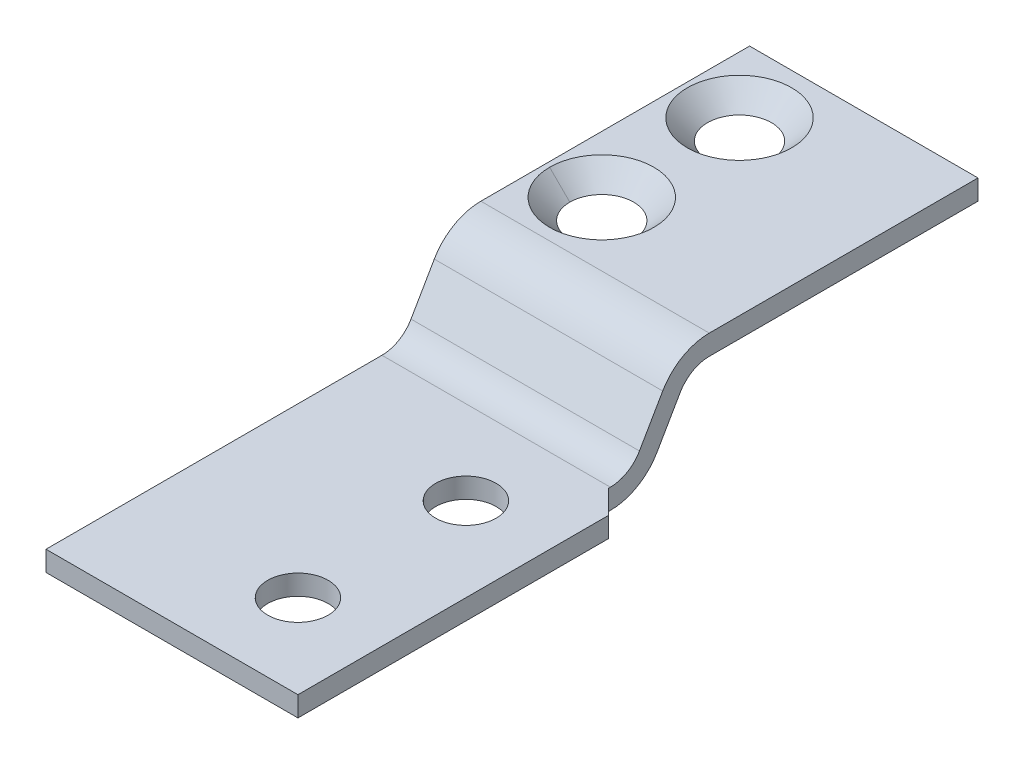
ISO-10303-21;
HEADER;
FILE_DESCRIPTION(('STEP AP214'),'2;1');
FILE_NAME('part.step','',(''),(''),'','','');
FILE_SCHEMA(('AUTOMOTIVE_DESIGN { 1 0 10303 214 1 1 1 1 }'));
ENDSEC;
DATA;
#1=APPLICATION_CONTEXT('core data for automotive mechanical design processes');
#2=APPLICATION_PROTOCOL_DEFINITION('international standard','automotive_design',2000,#1);
#3=PRODUCT_CONTEXT('',#1,'mechanical');
#4=PRODUCT('Part','Part','',(#3));
#5=PRODUCT_RELATED_PRODUCT_CATEGORY('part','',(#4));
#6=PRODUCT_DEFINITION_FORMATION('','',#4);
#7=PRODUCT_DEFINITION_CONTEXT('part definition',#1,'design');
#8=PRODUCT_DEFINITION('design','',#6,#7);
#9=PRODUCT_DEFINITION_SHAPE('','',#8);
#10=(LENGTH_UNIT() NAMED_UNIT(*) SI_UNIT(.MILLI.,.METRE.));
#11=(NAMED_UNIT(*) PLANE_ANGLE_UNIT() SI_UNIT($,.RADIAN.));
#12=(NAMED_UNIT(*) SI_UNIT($,.STERADIAN.) SOLID_ANGLE_UNIT());
#13=UNCERTAINTY_MEASURE_WITH_UNIT(LENGTH_MEASURE(1.E-05),#10,'distance_accuracy_value','');
#14=(GEOMETRIC_REPRESENTATION_CONTEXT(3) GLOBAL_UNCERTAINTY_ASSIGNED_CONTEXT((#13)) GLOBAL_UNIT_ASSIGNED_CONTEXT((#10,
#11,#12)) REPRESENTATION_CONTEXT('',''));
#15=CARTESIAN_POINT('',(0.,0.,0.));
#16=DIRECTION('',(0.,0.,1.));
#17=DIRECTION('',(1.,0.,0.));
#18=AXIS2_PLACEMENT_3D('',#15,#16,#17);
#19=CARTESIAN_POINT('',(91.4,-96.49999999997,27.28756443468));
#20=DIRECTION('',(0.,0.499999999995516,0.866025403787028));
#21=DIRECTION('',(0.,-0.866025403787028,0.499999999995516));
#22=AXIS2_PLACEMENT_3D('',#19,#20,#21);
#23=PLANE('',#22);
#24=DIRECTION('',(-1.,0.,0.));
#25=VECTOR('',#24,1.);
#26=CARTESIAN_POINT('',(94.936,-97.0999999999546,27.6339745961894));
#27=LINE('',#26,#25);
#28=CARTESIAN_POINT('',(88.,-97.0999999999769,27.6339745961979));
#29=VERTEX_POINT('',#28);
#30=CARTESIAN_POINT('',(94.8,-97.0999999999788,27.6339745962044));
#31=VERTEX_POINT('',#30);
#32=EDGE_CURVE('E219',#29,#31,#27,.F.);
#33=ORIENTED_EDGE('',*,*,#32,.T.);
#34=DIRECTION('',(0.,-0.866025403782222,0.500000000003839));
#35=VECTOR('',#34,1.);
#36=CARTESIAN_POINT('',(94.8,-95.89999999996,26.94115427316));
#37=LINE('',#36,#35);
#38=CARTESIAN_POINT('',(94.8,-95.8999999999769,26.9411542731708));
#39=VERTEX_POINT('',#38);
#40=EDGE_CURVE('E254',#39,#31,#37,.T.);
#41=ORIENTED_EDGE('',*,*,#40,.F.);
#42=DIRECTION('',(-1.,0.,0.));
#43=VECTOR('',#42,1.);
#44=CARTESIAN_POINT('',(94.936,-95.8999999999591,26.9411542731615));
#45=LINE('',#44,#43);
#46=CARTESIAN_POINT('',(88.,-95.8999999999826,26.9411542731763));
#47=VERTEX_POINT('',#46);
#48=EDGE_CURVE('E291',#47,#39,#45,.F.);
#49=ORIENTED_EDGE('',*,*,#48,.F.);
#50=DIRECTION('',(0.,-0.866025403787028,0.499999999995516));
#51=VECTOR('',#50,1.);
#52=CARTESIAN_POINT('',(88.,-96.49999999997,27.28756443468));
#53=LINE('',#52,#51);
#54=EDGE_CURVE('E137',#47,#29,#53,.T.);
#55=ORIENTED_EDGE('',*,*,#54,.T.);
#56=EDGE_LOOP('',(#33,#41,#49,#55));
#57=FACE_BOUND('',#56,.T.);
#58=ADVANCED_FACE('F17',(#57),#23,.T.);
#59=CARTESIAN_POINT('',(94.936,-96.7,25.55551362713));
#60=DIRECTION('',(-1.,0.,0.));
#61=DIRECTION('',(0.,0.,1.));
#62=AXIS2_PLACEMENT_3D('',#59,#60,#61);
#63=CYLINDRICAL_SURFACE('',#62,1.);
#64=CARTESIAN_POINT('',(88.,-96.7,25.55551362713));
#65=DIRECTION('',(-1.,0.,0.));
#66=DIRECTION('',(0.,0.,1.));
#67=AXIS2_PLACEMENT_3D('',#64,#65,#66);
#68=CIRCLE('',#67,1.);
#69=CARTESIAN_POINT('',(88.,-95.7,25.55551362713));
#70=VERTEX_POINT('',#69);
#71=CARTESIAN_POINT('',(88.,-96.1999999999997,26.4215390309084));
#72=VERTEX_POINT('',#71);
#73=EDGE_CURVE('E20',#70,#72,#68,.F.);
#74=ORIENTED_EDGE('',*,*,#73,.F.);
#75=DIRECTION('',(1.,0.,0.));
#76=VECTOR('',#75,1.);
#77=CARTESIAN_POINT('',(91.4,-95.7,25.55551362713));
#78=LINE('',#77,#76);
#79=CARTESIAN_POINT('',(94.8,-95.7,25.55551362713));
#80=VERTEX_POINT('',#79);
#81=EDGE_CURVE('E130',#70,#80,#78,.T.);
#82=ORIENTED_EDGE('',*,*,#81,.T.);
#83=CARTESIAN_POINT('',(94.8,-96.7,25.55551362713));
#84=DIRECTION('',(-1.,0.,0.));
#85=DIRECTION('',(0.,0.,1.));
#86=AXIS2_PLACEMENT_3D('',#83,#84,#85);
#87=CIRCLE('',#86,1.);
#88=CARTESIAN_POINT('',(94.8,-96.1999999999997,26.4215390309084));
#89=VERTEX_POINT('',#88);
#90=EDGE_CURVE('E266',#89,#80,#87,.T.);
#91=ORIENTED_EDGE('',*,*,#90,.F.);
#92=DIRECTION('',(1.,0.,0.));
#93=VECTOR('',#92,1.);
#94=CARTESIAN_POINT('',(91.4,-96.2000000000006,26.4215390309089));
#95=LINE('',#94,#93);
#96=EDGE_CURVE('E132',#89,#72,#95,.F.);
#97=ORIENTED_EDGE('',*,*,#96,.T.);
#98=EDGE_LOOP('',(#74,#82,#91,#97));
#99=FACE_BOUND('',#98,.T.);
#100=ADVANCED_FACE('F129',(#99),#63,.F.);
#101=CARTESIAN_POINT('',(91.4,-95.4,17.55551362713));
#102=DIRECTION('',(0.,0.,1.));
#103=DIRECTION('',(1.,0.,0.));
#104=AXIS2_PLACEMENT_3D('',#101,#102,#103);
#105=PLANE('',#104);
#106=DIRECTION('',(0.,1.,0.));
#107=VECTOR('',#106,1.);
#108=CARTESIAN_POINT('',(88.,-95.4,17.55551362713));
#109=LINE('',#108,#107);
#110=CARTESIAN_POINT('',(88.,-95.1,17.55551362713));
#111=VERTEX_POINT('',#110);
#112=CARTESIAN_POINT('',(88.,-95.7,17.55551362713));
#113=VERTEX_POINT('',#112);
#114=EDGE_CURVE('E136',#111,#113,#109,.F.);
#115=ORIENTED_EDGE('',*,*,#114,.F.);
#116=DIRECTION('',(1.,0.,0.));
#117=VECTOR('',#116,1.);
#118=CARTESIAN_POINT('',(91.4,-95.1,17.55551362713));
#119=LINE('',#118,#117);
#120=CARTESIAN_POINT('',(94.8,-95.1,17.55551362713));
#121=VERTEX_POINT('',#120);
#122=EDGE_CURVE('E205',#121,#111,#119,.F.);
#123=ORIENTED_EDGE('',*,*,#122,.F.);
#124=DIRECTION('',(0.,1.,0.));
#125=VECTOR('',#124,1.);
#126=CARTESIAN_POINT('',(94.8,-96.65,17.55551362713));
#127=LINE('',#126,#125);
#128=CARTESIAN_POINT('',(94.8,-95.7,17.55551362713));
#129=VERTEX_POINT('',#128);
#130=EDGE_CURVE('E264',#129,#121,#127,.T.);
#131=ORIENTED_EDGE('',*,*,#130,.F.);
#132=DIRECTION('',(1.,0.,0.));
#133=VECTOR('',#132,1.);
#134=CARTESIAN_POINT('',(91.4,-95.7,17.55551362713));
#135=LINE('',#134,#133);
#136=EDGE_CURVE('E147',#129,#113,#135,.F.);
#137=ORIENTED_EDGE('',*,*,#136,.T.);
#138=EDGE_LOOP('',(#115,#123,#131,#137));
#139=FACE_BOUND('',#138,.T.);
#140=ADVANCED_FACE('F382',(#139),#105,.F.);
#141=CARTESIAN_POINT('',(94.936,-96.7,25.55551362713));
#142=DIRECTION('',(-1.,0.,0.));
#143=DIRECTION('',(0.,0.,1.));
#144=AXIS2_PLACEMENT_3D('',#141,#142,#143);
#145=CYLINDRICAL_SURFACE('',#144,1.6);
#146=ORIENTED_EDGE('',*,*,#48,.T.);
#147=CARTESIAN_POINT('',(94.8,-96.7,25.55551362713));
#148=DIRECTION('',(-1.,0.,0.));
#149=DIRECTION('',(0.,0.,1.));
#150=AXIS2_PLACEMENT_3D('',#147,#148,#149);
#151=CIRCLE('',#150,1.6);
#152=CARTESIAN_POINT('',(94.8,-95.1,25.55551369671));
#153=VERTEX_POINT('',#152);
#154=EDGE_CURVE('E258',#153,#39,#151,.F.);
#155=ORIENTED_EDGE('',*,*,#154,.F.);
#156=DIRECTION('',(1.,0.,0.));
#157=VECTOR('',#156,1.);
#158=CARTESIAN_POINT('',(91.4,-95.1,25.55551376629));
#159=LINE('',#158,#157);
#160=CARTESIAN_POINT('',(88.,-95.1,25.55551369671));
#161=VERTEX_POINT('',#160);
#162=EDGE_CURVE('E202',#161,#153,#159,.T.);
#163=ORIENTED_EDGE('',*,*,#162,.F.);
#164=CARTESIAN_POINT('',(88.,-96.7,25.55551362713));
#165=DIRECTION('',(-1.,0.,0.));
#166=DIRECTION('',(0.,0.,1.));
#167=AXIS2_PLACEMENT_3D('',#164,#165,#166);
#168=CIRCLE('',#167,1.6);
#169=EDGE_CURVE('E270',#161,#47,#168,.F.);
#170=ORIENTED_EDGE('',*,*,#169,.T.);
#171=EDGE_LOOP('',(#146,#155,#163,#170));
#172=FACE_BOUND('',#171,.T.);
#173=ADVANCED_FACE('F331',(#172),#145,.T.);
#174=CARTESIAN_POINT('',(94.8,-96.65,23.05551362713));
#175=DIRECTION('',(1.,0.,0.));
#176=DIRECTION('',(0.,0.,-1.));
#177=AXIS2_PLACEMENT_3D('',#174,#175,#176);
#178=PLANE('',#177);
#179=CARTESIAN_POINT('',(94.8,-96.6,28.5));
#180=DIRECTION('',(-1.,0.,0.));
#181=DIRECTION('',(0.,0.,1.));
#182=AXIS2_PLACEMENT_3D('',#179,#180,#181);
#183=CIRCLE('',#182,1.6);
#184=CARTESIAN_POINT('',(94.8,-98.2,28.499999874465));
#185=VERTEX_POINT('',#184);
#186=CARTESIAN_POINT('',(94.8,-97.3999999999927,27.1143593539397));
#187=VERTEX_POINT('',#186);
#188=EDGE_CURVE('E248',#185,#187,#183,.F.);
#189=ORIENTED_EDGE('',*,*,#188,.T.);
#190=DIRECTION('',(0.,-0.866025403782302,0.500000000003701));
#191=VECTOR('',#190,1.);
#192=CARTESIAN_POINT('',(94.8,-96.79999999999,26.76794919242));
#193=LINE('',#192,#191);
#194=EDGE_CURVE('E216',#187,#89,#193,.F.);
#195=ORIENTED_EDGE('',*,*,#194,.T.);
#196=ORIENTED_EDGE('',*,*,#90,.T.);
#197=DIRECTION('',(0.,0.,1.));
#198=VECTOR('',#197,1.);
#199=CARTESIAN_POINT('',(94.8,-95.7,21.55551362713));
#200=LINE('',#199,#198);
#201=EDGE_CURVE('E145',#80,#129,#200,.F.);
#202=ORIENTED_EDGE('',*,*,#201,.T.);
#203=ORIENTED_EDGE('',*,*,#130,.T.);
#204=DIRECTION('',(0.,0.,1.));
#205=VECTOR('',#204,1.);
#206=CARTESIAN_POINT('',(94.8,-95.1,21.55551369671));
#207=LINE('',#206,#205);
#208=EDGE_CURVE('E204',#153,#121,#207,.F.);
#209=ORIENTED_EDGE('',*,*,#208,.F.);
#210=ORIENTED_EDGE('',*,*,#154,.T.);
#211=ORIENTED_EDGE('',*,*,#40,.T.);
#212=CARTESIAN_POINT('',(94.8,-96.6,28.5));
#213=DIRECTION('',(-1.,0.,0.));
#214=DIRECTION('',(0.,0.,1.));
#215=AXIS2_PLACEMENT_3D('',#212,#213,#214);
#216=CIRCLE('',#215,1.);
#217=CARTESIAN_POINT('',(94.8,-97.6,28.5));
#218=VERTEX_POINT('',#217);
#219=EDGE_CURVE('E322',#31,#218,#216,.T.);
#220=ORIENTED_EDGE('',*,*,#219,.T.);
#221=DIRECTION('',(0.,0.,-1.));
#222=VECTOR('',#221,1.);
#223=CARTESIAN_POINT('',(94.8,-97.6,23.05551362713));
#224=LINE('',#223,#222);
#225=CARTESIAN_POINT('',(94.8,-97.6,28.55551362713));
#226=VERTEX_POINT('',#225);
#227=EDGE_CURVE('E252',#218,#226,#224,.F.);
#228=ORIENTED_EDGE('',*,*,#227,.T.);
#229=DIRECTION('',(0.,1.,0.));
#230=VECTOR('',#229,1.);
#231=CARTESIAN_POINT('',(94.8,-96.65,28.55551362713));
#232=LINE('',#231,#230);
#233=CARTESIAN_POINT('',(94.8,-98.2,28.55551362713));
#234=VERTEX_POINT('',#233);
#235=EDGE_CURVE('E249',#226,#234,#232,.F.);
#236=ORIENTED_EDGE('',*,*,#235,.T.);
#237=DIRECTION('',(0.,0.,-1.));
#238=VECTOR('',#237,1.);
#239=CARTESIAN_POINT('',(94.8,-98.2,23.05551362713));
#240=LINE('',#239,#238);
#241=EDGE_CURVE('E241',#234,#185,#240,.T.);
#242=ORIENTED_EDGE('',*,*,#241,.T.);
#243=EDGE_LOOP('',(#189,#195,#196,#202,#203,#209,#210,#211,#220,#228,#236,#242));
#244=FACE_BOUND('',#243,.T.);
#245=ADVANCED_FACE('F340',(#244),#178,.T.);
#246=CARTESIAN_POINT('',(89.7,-95.1007679145732,19.55551362713));
#247=DIRECTION('',(0.,1.,0.));
#248=DIRECTION('',(0.,0.,1.));
#249=AXIS2_PLACEMENT_3D('',#246,#247,#248);
#250=CONICAL_SURFACE('',#249,1.55102813042636,0.785977484097372);
#251=CARTESIAN_POINT('',(89.7,-95.1,19.55551362713));
#252=DIRECTION('',(0.,1.,0.));
#253=DIRECTION('',(0.,0.,1.));
#254=AXIS2_PLACEMENT_3D('',#251,#252,#253);
#255=CIRCLE('',#254,1.55179693525306);
#256=CARTESIAN_POINT('',(89.7,-95.1,21.1073105623831));
#257=VERTEX_POINT('',#256);
#258=EDGE_CURVE('E261',#257,#257,#255,.F.);
#259=ORIENTED_EDGE('',*,*,#258,.F.);
#260=EDGE_LOOP('',(#259));
#261=FACE_BOUND('',#260,.T.);
#262=CARTESIAN_POINT('',(89.7,-95.7000000000221,19.55551362713));
#263=DIRECTION('',(0.,1.,0.));
#264=DIRECTION('',(0.,0.,1.));
#265=AXIS2_PLACEMENT_3D('',#262,#263,#264);
#266=CIRCLE('',#265,0.951101347458419);
#267=CARTESIAN_POINT('',(89.7,-95.7000000000221,20.5066149745884));
#268=VERTEX_POINT('',#267);
#269=EDGE_CURVE('E146',#268,#268,#266,.F.);
#270=ORIENTED_EDGE('',*,*,#269,.T.);
#271=EDGE_LOOP('',(#270));
#272=FACE_BOUND('',#271,.T.);
#273=ADVANCED_FACE('F437',(#261,#272),#250,.F.);
#274=CARTESIAN_POINT('',(89.7,-95.0971725221166,23.65551362713));
#275=DIRECTION('',(0.,1.,0.));
#276=DIRECTION('',(-1.,0.,0.));
#277=AXIS2_PLACEMENT_3D('',#274,#275,#276);
#278=CONICAL_SURFACE('',#277,1.55462769110323,0.785977484073824);
#279=CARTESIAN_POINT('',(88.1489726372563,-95.1007679145164,23.65705692405));
#280=CARTESIAN_POINT('',(88.1739695082404,-95.1257359160932,23.6569677476897));
#281=CARTESIAN_POINT('',(88.1989663883074,-95.1507039196809,23.6568816803606));
#282=CARTESIAN_POINT('',(88.2489601614474,-95.2006399268563,23.6567157637828));
#283=CARTESIAN_POINT('',(88.2739570545205,-95.2256079304441,23.6566359145333));
#284=CARTESIAN_POINT('',(88.3239508525732,-95.2755439376535,23.6564824341167));
#285=CARTESIAN_POINT('',(88.3489477575528,-95.3005119412752,23.6564088029488));
#286=CARTESIAN_POINT('',(88.398941578154,-95.350447948468,23.6562677586969));
#287=CARTESIAN_POINT('',(88.4239384937754,-95.375415952039,23.656200345612));
#288=CARTESIAN_POINT('',(88.4739323345935,-95.4253519591697,23.6560717375278));
#289=CARTESIAN_POINT('',(88.49892925979,-95.4503199627293,23.6560105425276));
#290=CARTESIAN_POINT('',(88.5489231185755,-95.5002559698976,23.655894370614));
#291=CARTESIAN_POINT('',(88.5739200521644,-95.5252239735064,23.6558393936997));
#292=CARTESIAN_POINT('',(88.6239139265909,-95.5751599807377,23.655735657959));
#293=CARTESIAN_POINT('',(88.6489108674284,-95.6001279843602,23.6556868991318));
#294=CARTESIAN_POINT('',(88.6989047551301,-95.6500639915673,23.6555955995659));
#295=CARTESIAN_POINT('',(88.7239017019943,-95.675031995152,23.6555530588266));
#296=CARTESIAN_POINT('',(88.7488986525356,-95.6999999999653,23.65551362713));
#297=B_SPLINE_CURVE_WITH_KNOTS('',3,(#279,#280,#281,#282,#283,#284,#285,#286,#287,#288,#289,
#290,#291,#292,#293,#294,#295,#296),.UNSPECIFIED.,.F.,.F.,(4,2,2,2,2,2,2,2,4),(0.,
0.105991855811851,0.211983695428261,0.317975519871001,0.423967329558897,0.529959125594103,
0.63595090887775,0.741942680190418,0.847934440111723),.UNSPECIFIED.);
#298=CARTESIAN_POINT('',(88.1489096834027,-95.1003839586743,23.6570569866901));
#299=VERTEX_POINT('',#298);
#300=CARTESIAN_POINT('',(88.7488986525356,-95.6999999999653,23.65551362713));
#301=VERTEX_POINT('',#300);
#302=EDGE_CURVE('E222',#299,#301,#297,.T.);
#303=ORIENTED_EDGE('',*,*,#302,.T.);
#304=CARTESIAN_POINT('',(89.7,-95.6999999999654,23.65551362713));
#305=DIRECTION('',(0.,1.,0.));
#306=DIRECTION('',(-1.,0.,0.));
#307=AXIS2_PLACEMENT_3D('',#304,#305,#306);
#308=CIRCLE('',#307,0.951101347464431);
#309=CARTESIAN_POINT('',(90.6511013474644,-95.6999999999653,23.65551362713));
#310=VERTEX_POINT('',#309);
#311=EDGE_CURVE('E208',#301,#310,#308,.F.);
#312=ORIENTED_EDGE('',*,*,#311,.T.);
#313=CARTESIAN_POINT('',(90.6511013474644,-95.6999999999653,23.65551362713));
#314=CARTESIAN_POINT('',(90.676092150029,-95.6750381359937,23.6554772097435));
#315=CARTESIAN_POINT('',(90.7010829494629,-95.650076273076,23.6554379216875));
#316=CARTESIAN_POINT('',(90.7510645432152,-95.6001525472026,23.6553536042347));
#317=CARTESIAN_POINT('',(90.7760553375334,-95.5751906842469,23.6553085748375));
#318=CARTESIAN_POINT('',(90.8260369199922,-95.5252669583575,23.6552127747032));
#319=CARTESIAN_POINT('',(90.8510277081327,-95.5003050954237,23.6551620039655));
#320=CARTESIAN_POINT('',(90.9010092772322,-95.4503813695445,23.655054721151));
#321=CARTESIAN_POINT('',(90.9260000581911,-95.425419506599,23.6549982090737));
#322=CARTESIAN_POINT('',(90.975981612003,-95.3754957807235,23.6548794435811));
#323=CARTESIAN_POINT('',(91.000972384856,-95.3505339177936,23.6548171901652));
#324=CARTESIAN_POINT('',(91.0509539213824,-95.3006101919402,23.6546869419966));
#325=CARTESIAN_POINT('',(91.0759446850558,-95.2756483290168,23.6546189472432));
#326=CARTESIAN_POINT('',(91.125926202327,-95.2257246031376,23.6544772164011));
#327=CARTESIAN_POINT('',(91.1509169559249,-95.2007627401818,23.6544034803116));
#328=CARTESIAN_POINT('',(91.2008984519748,-95.150839014308,23.6542502667989));
#329=CARTESIAN_POINT('',(91.2258891944268,-95.12587715139,23.6541707893748));
#330=CARTESIAN_POINT('',(91.2508799291202,-95.1009152901747,23.65408844129));
#331=B_SPLINE_CURVE_WITH_KNOTS('',3,(#313,#314,#315,#316,#317,#318,#319,#320,#321,#322,#323,
#324,#325,#326,#327,#328,#329,#330),.UNSPECIFIED.,.F.,.F.,(4,2,2,2,2,2,2,2,4),(0.,
0.105965681723449,0.211931373226913,0.317897074928918,0.423862787569564,0.529828511929177,
0.63579424854685,0.741759998403885,0.847725761878635),.UNSPECIFIED.);
#332=CARTESIAN_POINT('',(91.2510138734714,-95.1004023410359,23.6540883184477));
#333=VERTEX_POINT('',#332);
#334=EDGE_CURVE('E240',#310,#333,#331,.T.);
#335=ORIENTED_EDGE('',*,*,#334,.T.);
#336=CARTESIAN_POINT('',(89.7,-95.1,23.65551362713));
#337=DIRECTION('',(0.,1.,0.));
#338=DIRECTION('',(0.,0.,1.));
#339=AXIS2_PLACEMENT_3D('',#336,#337,#338);
#340=CIRCLE('',#339,1.55179693528768);
#341=EDGE_CURVE('E304',#299,#333,#340,.F.);
#342=ORIENTED_EDGE('',*,*,#341,.F.);
#343=EDGE_LOOP('',(#303,#312,#335,#342));
#344=FACE_BOUND('',#343,.T.);
#345=ADVANCED_FACE('F432',(#344),#278,.F.);
#346=CARTESIAN_POINT('',(89.7,-95.1007679145164,23.65551362713));
#347=DIRECTION('',(0.,1.,0.));
#348=DIRECTION('',(-1.,0.,0.));
#349=AXIS2_PLACEMENT_3D('',#346,#347,#348);
#350=CONICAL_SURFACE('',#349,1.55102813054605,0.785977484097372);
#351=CARTESIAN_POINT('',(89.7,-95.1,23.65551362713));
#352=DIRECTION('',(0.,1.,0.));
#353=DIRECTION('',(0.,0.,1.));
#354=AXIS2_PLACEMENT_3D('',#351,#352,#353);
#355=CIRCLE('',#354,1.55179693531584);
#356=EDGE_CURVE('E201',#333,#299,#355,.F.);
#357=ORIENTED_EDGE('',*,*,#356,.F.);
#358=ORIENTED_EDGE('',*,*,#334,.F.);
#359=CARTESIAN_POINT('',(89.7,-95.6999999999653,23.65551362713));
#360=DIRECTION('',(0.,1.,0.));
#361=DIRECTION('',(-1.,0.,0.));
#362=AXIS2_PLACEMENT_3D('',#359,#360,#361);
#363=CIRCLE('',#362,0.951101347464425);
#364=EDGE_CURVE('E315',#310,#301,#363,.F.);
#365=ORIENTED_EDGE('',*,*,#364,.T.);
#366=ORIENTED_EDGE('',*,*,#302,.F.);
#367=EDGE_LOOP('',(#357,#358,#365,#366));
#368=FACE_BOUND('',#367,.T.);
#369=ADVANCED_FACE('F230',(#368),#350,.F.);
#370=CARTESIAN_POINT('',(94.936,-96.6,28.5));
#371=DIRECTION('',(-1.,0.,0.));
#372=DIRECTION('',(0.,0.,1.));
#373=AXIS2_PLACEMENT_3D('',#370,#371,#372);
#374=CYLINDRICAL_SURFACE('',#373,1.);
#375=CARTESIAN_POINT('',(88.,-96.6,28.5));
#376=DIRECTION('',(-1.,0.,0.));
#377=DIRECTION('',(0.,0.,1.));
#378=AXIS2_PLACEMENT_3D('',#375,#376,#377);
#379=CIRCLE('',#378,1.);
#380=CARTESIAN_POINT('',(88.,-97.6,28.5));
#381=VERTEX_POINT('',#380);
#382=EDGE_CURVE('E279',#381,#29,#379,.F.);
#383=ORIENTED_EDGE('',*,*,#382,.F.);
#384=DIRECTION('',(1.,0.,0.));
#385=VECTOR('',#384,1.);
#386=CARTESIAN_POINT('',(91.75,-97.6,28.5));
#387=LINE('',#386,#385);
#388=EDGE_CURVE('E160',#218,#381,#387,.F.);
#389=ORIENTED_EDGE('',*,*,#388,.F.);
#390=ORIENTED_EDGE('',*,*,#219,.F.);
#391=ORIENTED_EDGE('',*,*,#32,.F.);
#392=EDGE_LOOP('',(#383,#389,#390,#391));
#393=FACE_BOUND('',#392,.T.);
#394=ADVANCED_FACE('F228',(#393),#374,.F.);
#395=CARTESIAN_POINT('',(91.4,-96.79999999999,26.76794919242));
#396=DIRECTION('',(0.,0.500000000003701,0.866025403782302));
#397=DIRECTION('',(0.,-0.866025403782302,0.500000000003701));
#398=AXIS2_PLACEMENT_3D('',#395,#396,#397);
#399=PLANE('',#398);
#400=DIRECTION('',(0.,-0.866025403782302,0.500000000003701));
#401=VECTOR('',#400,1.);
#402=CARTESIAN_POINT('',(88.,-96.79999999999,26.76794919242));
#403=LINE('',#402,#401);
#404=CARTESIAN_POINT('',(88.,-97.3999999999927,27.1143593539397));
#405=VERTEX_POINT('',#404);
#406=EDGE_CURVE('E214',#72,#405,#403,.T.);
#407=ORIENTED_EDGE('',*,*,#406,.F.);
#408=ORIENTED_EDGE('',*,*,#96,.F.);
#409=ORIENTED_EDGE('',*,*,#194,.F.);
#410=DIRECTION('',(-1.,0.,0.));
#411=VECTOR('',#410,1.);
#412=CARTESIAN_POINT('',(94.936,-97.3999999999785,27.1143593539325));
#413=LINE('',#412,#411);
#414=EDGE_CURVE('E154',#405,#187,#413,.F.);
#415=ORIENTED_EDGE('',*,*,#414,.F.);
#416=EDGE_LOOP('',(#407,#408,#409,#415));
#417=FACE_BOUND('',#416,.T.);
#418=ADVANCED_FACE('F377',(#417),#399,.F.);
#419=CARTESIAN_POINT('',(91.4,-95.7,21.55551362713));
#420=DIRECTION('',(0.,1.,0.));
#421=DIRECTION('',(0.,0.,1.));
#422=AXIS2_PLACEMENT_3D('',#419,#420,#421);
#423=PLANE('',#422);
#424=ORIENTED_EDGE('',*,*,#311,.F.);
#425=ORIENTED_EDGE('',*,*,#364,.F.);
#426=EDGE_LOOP('',(#424,#425));
#427=FACE_BOUND('',#426,.T.);
#428=ORIENTED_EDGE('',*,*,#269,.F.);
#429=EDGE_LOOP('',(#428));
#430=FACE_BOUND('',#429,.T.);
#431=DIRECTION('',(0.,0.,-1.));
#432=VECTOR('',#431,1.);
#433=CARTESIAN_POINT('',(88.,-95.7,28.02775681356));
#434=LINE('',#433,#432);
#435=EDGE_CURVE('E143',#70,#113,#434,.T.);
#436=ORIENTED_EDGE('',*,*,#435,.T.);
#437=ORIENTED_EDGE('',*,*,#136,.F.);
#438=ORIENTED_EDGE('',*,*,#201,.F.);
#439=ORIENTED_EDGE('',*,*,#81,.F.);
#440=EDGE_LOOP('',(#436,#437,#438,#439));
#441=FACE_BOUND('',#440,.T.);
#442=ADVANCED_FACE('F141',(#427,#430,#441),#423,.F.);
#443=CARTESIAN_POINT('',(91.4,-95.1,21.55551369671));
#444=DIRECTION('',(0.,1.,0.));
#445=DIRECTION('',(0.,0.,1.));
#446=AXIS2_PLACEMENT_3D('',#443,#444,#445);
#447=PLANE('',#446);
#448=ORIENTED_EDGE('',*,*,#341,.T.);
#449=ORIENTED_EDGE('',*,*,#356,.T.);
#450=EDGE_LOOP('',(#448,#449));
#451=FACE_BOUND('',#450,.T.);
#452=ORIENTED_EDGE('',*,*,#258,.T.);
#453=EDGE_LOOP('',(#452));
#454=FACE_BOUND('',#453,.T.);
#455=ORIENTED_EDGE('',*,*,#162,.T.);
#456=ORIENTED_EDGE('',*,*,#208,.T.);
#457=ORIENTED_EDGE('',*,*,#122,.T.);
#458=DIRECTION('',(0.,0.,-1.));
#459=VECTOR('',#458,1.);
#460=CARTESIAN_POINT('',(88.,-95.1,28.02775681356));
#461=LINE('',#460,#459);
#462=EDGE_CURVE('E153',#111,#161,#461,.F.);
#463=ORIENTED_EDGE('',*,*,#462,.T.);
#464=EDGE_LOOP('',(#455,#456,#457,#463));
#465=FACE_BOUND('',#464,.T.);
#466=ADVANCED_FACE('F381',(#451,#454,#465),#447,.T.);
#467=CARTESIAN_POINT('',(91.75,-97.6,33.5));
#468=DIRECTION('',(0.,1.,0.));
#469=DIRECTION('',(0.,0.,1.));
#470=AXIS2_PLACEMENT_3D('',#467,#468,#469);
#471=PLANE('',#470);
#472=CARTESIAN_POINT('',(93.,-97.6,31.));
#473=DIRECTION('',(0.,1.,0.));
#474=DIRECTION('',(0.,0.,1.));
#475=AXIS2_PLACEMENT_3D('',#472,#473,#474);
#476=CIRCLE('',#475,0.9);
#477=CARTESIAN_POINT('',(93.,-97.6,31.9));
#478=VERTEX_POINT('',#477);
#479=EDGE_CURVE('E171',#478,#478,#476,.F.);
#480=ORIENTED_EDGE('',*,*,#479,.T.);
#481=EDGE_LOOP('',(#480));
#482=FACE_BOUND('',#481,.T.);
#483=CARTESIAN_POINT('',(93.,-97.6,36.));
#484=DIRECTION('',(0.,1.,0.));
#485=DIRECTION('',(0.,0.,1.));
#486=AXIS2_PLACEMENT_3D('',#483,#484,#485);
#487=CIRCLE('',#486,0.9);
#488=CARTESIAN_POINT('',(93.,-97.6,36.9));
#489=VERTEX_POINT('',#488);
#490=EDGE_CURVE('E297',#489,#489,#487,.F.);
#491=ORIENTED_EDGE('',*,*,#490,.T.);
#492=EDGE_LOOP('',(#491));
#493=FACE_BOUND('',#492,.T.);
#494=DIRECTION('',(-0.707106781186548,0.,-0.707106781186548));
#495=VECTOR('',#494,1.);
#496=CARTESIAN_POINT('',(95.15,-97.6,28.90551362713));
#497=LINE('',#496,#495);
#498=CARTESIAN_POINT('',(95.5,-97.6,29.25551362713));
#499=VERTEX_POINT('',#498);
#500=EDGE_CURVE('E196',#226,#499,#497,.F.);
#501=ORIENTED_EDGE('',*,*,#500,.F.);
#502=ORIENTED_EDGE('',*,*,#227,.F.);
#503=ORIENTED_EDGE('',*,*,#388,.T.);
#504=DIRECTION('',(0.,0.,-1.));
#505=VECTOR('',#504,1.);
#506=CARTESIAN_POINT('',(88.,-97.6,28.02775681356));
#507=LINE('',#506,#505);
#508=CARTESIAN_POINT('',(88.,-97.6,38.5));
#509=VERTEX_POINT('',#508);
#510=EDGE_CURVE('E157',#381,#509,#507,.F.);
#511=ORIENTED_EDGE('',*,*,#510,.T.);
#512=DIRECTION('',(1.,0.,0.));
#513=VECTOR('',#512,1.);
#514=CARTESIAN_POINT('',(91.75,-97.6,38.5));
#515=LINE('',#514,#513);
#516=CARTESIAN_POINT('',(95.5,-97.6,38.5));
#517=VERTEX_POINT('',#516);
#518=EDGE_CURVE('E184',#517,#509,#515,.F.);
#519=ORIENTED_EDGE('',*,*,#518,.F.);
#520=DIRECTION('',(0.,0.,-1.));
#521=VECTOR('',#520,1.);
#522=CARTESIAN_POINT('',(95.5,-97.6,33.87775681357));
#523=LINE('',#522,#521);
#524=EDGE_CURVE('E183',#499,#517,#523,.F.);
#525=ORIENTED_EDGE('',*,*,#524,.F.);
#526=EDGE_LOOP('',(#501,#502,#503,#511,#519,#525));
#527=FACE_BOUND('',#526,.T.);
#528=ADVANCED_FACE('F347',(#482,#493,#527),#471,.T.);
#529=CARTESIAN_POINT('',(94.936,-96.6,28.5));
#530=DIRECTION('',(-1.,0.,0.));
#531=DIRECTION('',(0.,0.,1.));
#532=AXIS2_PLACEMENT_3D('',#529,#530,#531);
#533=CYLINDRICAL_SURFACE('',#532,1.6);
#534=ORIENTED_EDGE('',*,*,#414,.T.);
#535=ORIENTED_EDGE('',*,*,#188,.F.);
#536=DIRECTION('',(1.,0.,0.));
#537=VECTOR('',#536,1.);
#538=CARTESIAN_POINT('',(91.75,-98.2,28.49999974893));
#539=LINE('',#538,#537);
#540=CARTESIAN_POINT('',(88.,-98.2,28.499999874465));
#541=VERTEX_POINT('',#540);
#542=EDGE_CURVE('E167',#185,#541,#539,.F.);
#543=ORIENTED_EDGE('',*,*,#542,.T.);
#544=CARTESIAN_POINT('',(88.,-96.6,28.5));
#545=DIRECTION('',(-1.,0.,0.));
#546=DIRECTION('',(0.,0.,1.));
#547=AXIS2_PLACEMENT_3D('',#544,#545,#546);
#548=CIRCLE('',#547,1.6);
#549=EDGE_CURVE('E188',#541,#405,#548,.F.);
#550=ORIENTED_EDGE('',*,*,#549,.T.);
#551=EDGE_LOOP('',(#534,#535,#543,#550));
#552=FACE_BOUND('',#551,.T.);
#553=ADVANCED_FACE('F374',(#552),#533,.T.);
#554=CARTESIAN_POINT('',(88.,-96.65,28.02775681356));
#555=DIRECTION('',(1.,0.,0.));
#556=DIRECTION('',(0.,0.,-1.));
#557=AXIS2_PLACEMENT_3D('',#554,#555,#556);
#558=PLANE('',#557);
#559=DIRECTION('',(0.,0.,1.));
#560=VECTOR('',#559,1.);
#561=CARTESIAN_POINT('',(88.,-98.2,33.49999994421));
#562=LINE('',#561,#560);
#563=CARTESIAN_POINT('',(88.,-98.2,38.5));
#564=VERTEX_POINT('',#563);
#565=EDGE_CURVE('E170',#541,#564,#562,.T.);
#566=ORIENTED_EDGE('',*,*,#565,.T.);
#567=DIRECTION('',(0.,1.,0.));
#568=VECTOR('',#567,1.);
#569=CARTESIAN_POINT('',(88.,-97.9,38.5));
#570=LINE('',#569,#568);
#571=EDGE_CURVE('E181',#509,#564,#570,.F.);
#572=ORIENTED_EDGE('',*,*,#571,.F.);
#573=ORIENTED_EDGE('',*,*,#510,.F.);
#574=ORIENTED_EDGE('',*,*,#382,.T.);
#575=ORIENTED_EDGE('',*,*,#54,.F.);
#576=ORIENTED_EDGE('',*,*,#169,.F.);
#577=ORIENTED_EDGE('',*,*,#462,.F.);
#578=ORIENTED_EDGE('',*,*,#114,.T.);
#579=ORIENTED_EDGE('',*,*,#435,.F.);
#580=ORIENTED_EDGE('',*,*,#73,.T.);
#581=ORIENTED_EDGE('',*,*,#406,.T.);
#582=ORIENTED_EDGE('',*,*,#549,.F.);
#583=EDGE_LOOP('',(#566,#572,#573,#574,#575,#576,#577,#578,#579,#580,#581,#582));
#584=FACE_BOUND('',#583,.T.);
#585=ADVANCED_FACE('F150',(#584),#558,.F.);
#586=CARTESIAN_POINT('',(91.75,-97.9,38.5));
#587=DIRECTION('',(0.,0.,1.));
#588=DIRECTION('',(1.,0.,0.));
#589=AXIS2_PLACEMENT_3D('',#586,#587,#588);
#590=PLANE('',#589);
#591=DIRECTION('',(1.,0.,0.));
#592=VECTOR('',#591,1.);
#593=CARTESIAN_POINT('',(91.75,-98.2,38.5));
#594=LINE('',#593,#592);
#595=CARTESIAN_POINT('',(95.5,-98.2,38.5));
#596=VERTEX_POINT('',#595);
#597=EDGE_CURVE('E173',#564,#596,#594,.T.);
#598=ORIENTED_EDGE('',*,*,#597,.T.);
#599=DIRECTION('',(0.,1.,0.));
#600=VECTOR('',#599,1.);
#601=CARTESIAN_POINT('',(95.5,-97.9,38.5));
#602=LINE('',#601,#600);
#603=EDGE_CURVE('E192',#517,#596,#602,.F.);
#604=ORIENTED_EDGE('',*,*,#603,.F.);
#605=ORIENTED_EDGE('',*,*,#518,.T.);
#606=ORIENTED_EDGE('',*,*,#571,.T.);
#607=EDGE_LOOP('',(#598,#604,#605,#606));
#608=FACE_BOUND('',#607,.T.);
#609=ADVANCED_FACE('F366',(#608),#590,.T.);
#610=CARTESIAN_POINT('',(95.5,-97.9,33.87775681357));
#611=DIRECTION('',(1.,0.,0.));
#612=DIRECTION('',(0.,0.,-1.));
#613=AXIS2_PLACEMENT_3D('',#610,#611,#612);
#614=PLANE('',#613);
#615=ORIENTED_EDGE('',*,*,#603,.T.);
#616=DIRECTION('',(0.,0.,1.));
#617=VECTOR('',#616,1.);
#618=CARTESIAN_POINT('',(95.5,-98.2,33.49999994421));
#619=LINE('',#618,#617);
#620=CARTESIAN_POINT('',(95.5,-98.2,29.25551362713));
#621=VERTEX_POINT('',#620);
#622=EDGE_CURVE('E178',#596,#621,#619,.F.);
#623=ORIENTED_EDGE('',*,*,#622,.T.);
#624=DIRECTION('',(0.,1.,0.));
#625=VECTOR('',#624,1.);
#626=CARTESIAN_POINT('',(95.5,-97.9,29.25551362713));
#627=LINE('',#626,#625);
#628=EDGE_CURVE('E35',#499,#621,#627,.F.);
#629=ORIENTED_EDGE('',*,*,#628,.F.);
#630=ORIENTED_EDGE('',*,*,#524,.T.);
#631=EDGE_LOOP('',(#615,#623,#629,#630));
#632=FACE_BOUND('',#631,.T.);
#633=ADVANCED_FACE('F358',(#632),#614,.T.);
#634=CARTESIAN_POINT('',(95.15,-97.9,28.90551362713));
#635=DIRECTION('',(0.707106781186548,0.,-0.707106781186548));
#636=DIRECTION('',(-0.707106781186548,0.,-0.707106781186548));
#637=AXIS2_PLACEMENT_3D('',#634,#635,#636);
#638=PLANE('',#637);
#639=ORIENTED_EDGE('',*,*,#628,.T.);
#640=DIRECTION('',(-0.707106781186551,0.,-0.707106781186544));
#641=VECTOR('',#640,1.);
#642=CARTESIAN_POINT('',(95.5,-98.2,29.25551362713));
#643=LINE('',#642,#641);
#644=EDGE_CURVE('E281',#621,#234,#643,.T.);
#645=ORIENTED_EDGE('',*,*,#644,.T.);
#646=ORIENTED_EDGE('',*,*,#235,.F.);
#647=ORIENTED_EDGE('',*,*,#500,.T.);
#648=EDGE_LOOP('',(#639,#645,#646,#647));
#649=FACE_BOUND('',#648,.T.);
#650=ADVANCED_FACE('F369',(#649),#638,.T.);
#651=CARTESIAN_POINT('',(93.,-98.22695413463,36.));
#652=DIRECTION('',(0.,1.,0.));
#653=DIRECTION('',(0.,0.,1.));
#654=AXIS2_PLACEMENT_3D('',#651,#652,#653);
#655=CYLINDRICAL_SURFACE('',#654,0.9);
#656=ORIENTED_EDGE('',*,*,#490,.F.);
#657=EDGE_LOOP('',(#656));
#658=FACE_BOUND('',#657,.T.);
#659=CARTESIAN_POINT('',(93.,-98.2,36.));
#660=DIRECTION('',(0.,1.,0.));
#661=DIRECTION('',(0.,0.,1.));
#662=AXIS2_PLACEMENT_3D('',#659,#660,#661);
#663=CIRCLE('',#662,0.9);
#664=CARTESIAN_POINT('',(93.,-98.2,36.9));
#665=VERTEX_POINT('',#664);
#666=EDGE_CURVE('E26',#665,#665,#663,.F.);
#667=ORIENTED_EDGE('',*,*,#666,.T.);
#668=EDGE_LOOP('',(#667));
#669=FACE_BOUND('',#668,.T.);
#670=ADVANCED_FACE('F398',(#658,#669),#655,.F.);
#671=CARTESIAN_POINT('',(93.,-98.22695413463,31.));
#672=DIRECTION('',(0.,1.,0.));
#673=DIRECTION('',(0.,0.,1.));
#674=AXIS2_PLACEMENT_3D('',#671,#672,#673);
#675=CYLINDRICAL_SURFACE('',#674,0.9);
#676=ORIENTED_EDGE('',*,*,#479,.F.);
#677=EDGE_LOOP('',(#676));
#678=FACE_BOUND('',#677,.T.);
#679=CARTESIAN_POINT('',(93.,-98.2,31.));
#680=DIRECTION('',(0.,1.,0.));
#681=DIRECTION('',(0.,0.,1.));
#682=AXIS2_PLACEMENT_3D('',#679,#680,#681);
#683=CIRCLE('',#682,0.9);
#684=CARTESIAN_POINT('',(93.,-98.2,31.9));
#685=VERTEX_POINT('',#684);
#686=EDGE_CURVE('E11',#685,#685,#683,.F.);
#687=ORIENTED_EDGE('',*,*,#686,.T.);
#688=EDGE_LOOP('',(#687));
#689=FACE_BOUND('',#688,.T.);
#690=ADVANCED_FACE('F392',(#678,#689),#675,.F.);
#691=CARTESIAN_POINT('',(91.75,-98.2,33.49999994421));
#692=DIRECTION('',(0.,1.,0.));
#693=DIRECTION('',(0.,0.,1.));
#694=AXIS2_PLACEMENT_3D('',#691,#692,#693);
#695=PLANE('',#694);
#696=ORIENTED_EDGE('',*,*,#686,.F.);
#697=EDGE_LOOP('',(#696));
#698=FACE_BOUND('',#697,.T.);
#699=ORIENTED_EDGE('',*,*,#666,.F.);
#700=EDGE_LOOP('',(#699));
#701=FACE_BOUND('',#700,.T.);
#702=ORIENTED_EDGE('',*,*,#622,.F.);
#703=ORIENTED_EDGE('',*,*,#597,.F.);
#704=ORIENTED_EDGE('',*,*,#565,.F.);
#705=ORIENTED_EDGE('',*,*,#542,.F.);
#706=ORIENTED_EDGE('',*,*,#241,.F.);
#707=ORIENTED_EDGE('',*,*,#644,.F.);
#708=EDGE_LOOP('',(#702,#703,#704,#705,#706,#707));
#709=FACE_BOUND('',#708,.T.);
#710=ADVANCED_FACE('F362',(#698,#701,#709),#695,.F.);
#711=CLOSED_SHELL('',(#58,#100,#140,#173,#245,#273,#345,#369,#394,#418,#442,#466,#528,#553,#585,
#609,#633,#650,#670,#690,#710));
#712=MANIFOLD_SOLID_BREP('B1',#711);
#713=ADVANCED_BREP_SHAPE_REPRESENTATION('',(#18,#712),#14);
#714=SHAPE_DEFINITION_REPRESENTATION(#9,#713);
ENDSEC;
END-ISO-10303-21;
